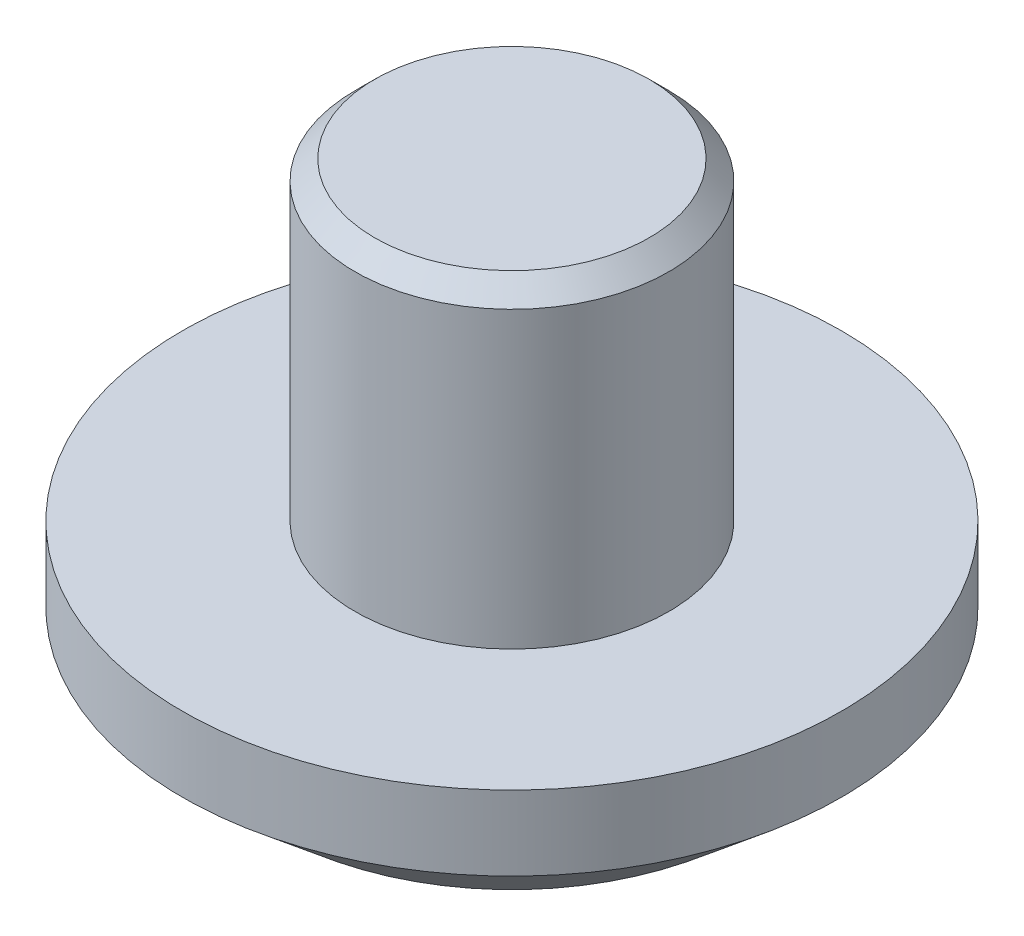
ISO-10303-21;
HEADER;
FILE_DESCRIPTION(('STEP AP214'),'2;1');
FILE_NAME('part.step','',(''),(''),'','','');
FILE_SCHEMA(('AUTOMOTIVE_DESIGN { 1 0 10303 214 1 1 1 1 }'));
ENDSEC;
DATA;
#1=APPLICATION_CONTEXT('core data for automotive mechanical design processes');
#2=APPLICATION_PROTOCOL_DEFINITION('international standard','automotive_design',2000,#1);
#3=PRODUCT_CONTEXT('',#1,'mechanical');
#4=PRODUCT('Part','Part','',(#3));
#5=PRODUCT_RELATED_PRODUCT_CATEGORY('part','',(#4));
#6=PRODUCT_DEFINITION_FORMATION('','',#4);
#7=PRODUCT_DEFINITION_CONTEXT('part definition',#1,'design');
#8=PRODUCT_DEFINITION('design','',#6,#7);
#9=PRODUCT_DEFINITION_SHAPE('','',#8);
#10=(LENGTH_UNIT() NAMED_UNIT(*) SI_UNIT(.MILLI.,.METRE.));
#11=(NAMED_UNIT(*) PLANE_ANGLE_UNIT() SI_UNIT($,.RADIAN.));
#12=(NAMED_UNIT(*) SI_UNIT($,.STERADIAN.) SOLID_ANGLE_UNIT());
#13=UNCERTAINTY_MEASURE_WITH_UNIT(LENGTH_MEASURE(1.E-05),#10,'distance_accuracy_value','');
#14=(GEOMETRIC_REPRESENTATION_CONTEXT(3) GLOBAL_UNCERTAINTY_ASSIGNED_CONTEXT((#13)) GLOBAL_UNIT_ASSIGNED_CONTEXT((#10,
#11,#12)) REPRESENTATION_CONTEXT('',''));
#15=CARTESIAN_POINT('',(0.,0.,0.));
#16=DIRECTION('',(0.,0.,1.));
#17=DIRECTION('',(1.,0.,0.));
#18=AXIS2_PLACEMENT_3D('',#15,#16,#17);
#19=CARTESIAN_POINT('',(4.2,0.,0.));
#20=DIRECTION('',(0.,1.,0.));
#21=DIRECTION('',(0.,0.,1.));
#22=AXIS2_PLACEMENT_3D('',#19,#20,#21);
#23=PLANE('',#22);
#24=CARTESIAN_POINT('',(0.,0.,0.));
#25=DIRECTION('',(0.,-1.,0.));
#26=DIRECTION('',(0.,0.,-1.));
#27=AXIS2_PLACEMENT_3D('',#24,#25,#26);
#28=CIRCLE('',#27,2.);
#29=CARTESIAN_POINT('',(0.,0.,-2.));
#30=VERTEX_POINT('',#29);
#31=EDGE_CURVE('E147',#30,#30,#28,.T.);
#32=ORIENTED_EDGE('',*,*,#31,.T.);
#33=EDGE_LOOP('',(#32));
#34=FACE_BOUND('',#33,.T.);
#35=CARTESIAN_POINT('',(0.,0.,0.));
#36=DIRECTION('',(0.,-1.,0.));
#37=DIRECTION('',(0.,0.,-1.));
#38=AXIS2_PLACEMENT_3D('',#35,#36,#37);
#39=CIRCLE('',#38,4.2);
#40=CARTESIAN_POINT('',(0.,0.,-4.2));
#41=VERTEX_POINT('',#40);
#42=EDGE_CURVE('E11',#41,#41,#39,.T.);
#43=ORIENTED_EDGE('',*,*,#42,.F.);
#44=EDGE_LOOP('',(#43));
#45=FACE_BOUND('',#44,.T.);
#46=ADVANCED_FACE('F39',(#34,#45),#23,.T.);
#47=CARTESIAN_POINT('',(0.,0.,0.));
#48=DIRECTION('',(0.,-1.,0.));
#49=DIRECTION('',(0.,0.,-1.));
#50=AXIS2_PLACEMENT_3D('',#47,#48,#49);
#51=CYLINDRICAL_SURFACE('',#50,4.2);
#52=ORIENTED_EDGE('',*,*,#42,.T.);
#53=EDGE_LOOP('',(#52));
#54=FACE_BOUND('',#53,.T.);
#55=CARTESIAN_POINT('',(0.,-0.95,0.));
#56=DIRECTION('',(0.,-1.,0.));
#57=DIRECTION('',(0.,0.,-1.));
#58=AXIS2_PLACEMENT_3D('',#55,#56,#57);
#59=CIRCLE('',#58,4.2);
#60=CARTESIAN_POINT('',(0.,-0.95,-4.2));
#61=VERTEX_POINT('',#60);
#62=EDGE_CURVE('E46',#61,#61,#59,.T.);
#63=ORIENTED_EDGE('',*,*,#62,.F.);
#64=EDGE_LOOP('',(#63));
#65=FACE_BOUND('',#64,.T.);
#66=ADVANCED_FACE('F216',(#54,#65),#51,.T.);
#67=CARTESIAN_POINT('',(0.,-1.9,0.));
#68=DIRECTION('',(0.,1.,0.));
#69=DIRECTION('',(0.,0.,1.));
#70=AXIS2_PLACEMENT_3D('',#67,#68,#69);
#71=CONICAL_SURFACE('',#70,3.0678340870355,0.872664625997167);
#72=ORIENTED_EDGE('',*,*,#62,.T.);
#73=EDGE_LOOP('',(#72));
#74=FACE_BOUND('',#73,.T.);
#75=CARTESIAN_POINT('',(0.,-1.9,0.));
#76=DIRECTION('',(0.,-1.,0.));
#77=DIRECTION('',(0.,0.,-1.));
#78=AXIS2_PLACEMENT_3D('',#75,#76,#77);
#79=CIRCLE('',#78,3.0678340870355);
#80=CARTESIAN_POINT('',(0.,-1.9,-3.0678340870355));
#81=VERTEX_POINT('',#80);
#82=EDGE_CURVE('E231',#81,#81,#79,.T.);
#83=ORIENTED_EDGE('',*,*,#82,.F.);
#84=EDGE_LOOP('',(#83));
#85=FACE_BOUND('',#84,.T.);
#86=ADVANCED_FACE('F221',(#74,#85),#71,.T.);
#87=CARTESIAN_POINT('',(1.25,-1.9,0.));
#88=DIRECTION('',(0.,-1.,0.));
#89=DIRECTION('',(0.,0.,-1.));
#90=AXIS2_PLACEMENT_3D('',#87,#88,#89);
#91=PLANE('',#90);
#92=DIRECTION('',(0.5,0.,-0.866025403784438));
#93=VECTOR('',#92,1.);
#94=CARTESIAN_POINT('',(-1.44337567297406,-1.9,0.));
#95=LINE('',#94,#93);
#96=CARTESIAN_POINT('',(-1.44337567297406,-1.9,0.));
#97=VERTEX_POINT('',#96);
#98=CARTESIAN_POINT('',(-0.721687836487032,-1.9,-1.25));
#99=VERTEX_POINT('',#98);
#100=EDGE_CURVE('E125',#97,#99,#95,.T.);
#101=ORIENTED_EDGE('',*,*,#100,.F.);
#102=DIRECTION('',(-0.499999999999999,0.,-0.866025403784439));
#103=VECTOR('',#102,1.);
#104=CARTESIAN_POINT('',(-0.721687836487033,-1.9,1.25));
#105=LINE('',#104,#103);
#106=CARTESIAN_POINT('',(-0.721687836487033,-1.9,1.25));
#107=VERTEX_POINT('',#106);
#108=EDGE_CURVE('E120',#107,#97,#105,.T.);
#109=ORIENTED_EDGE('',*,*,#108,.F.);
#110=DIRECTION('',(-1.,0.,0.));
#111=VECTOR('',#110,1.);
#112=CARTESIAN_POINT('',(0.721687836487032,-1.9,1.25));
#113=LINE('',#112,#111);
#114=CARTESIAN_POINT('',(0.721687836487032,-1.9,1.25));
#115=VERTEX_POINT('',#114);
#116=EDGE_CURVE('E118',#115,#107,#113,.T.);
#117=ORIENTED_EDGE('',*,*,#116,.F.);
#118=DIRECTION('',(-0.5,0.,0.866025403784438));
#119=VECTOR('',#118,1.);
#120=CARTESIAN_POINT('',(1.44337567297406,-1.9,0.));
#121=LINE('',#120,#119);
#122=CARTESIAN_POINT('',(1.44337567297406,-1.9,0.));
#123=VERTEX_POINT('',#122);
#124=EDGE_CURVE('E103',#123,#115,#121,.T.);
#125=ORIENTED_EDGE('',*,*,#124,.F.);
#126=DIRECTION('',(0.499999999999999,0.,0.866025403784439));
#127=VECTOR('',#126,1.);
#128=CARTESIAN_POINT('',(0.721687836487033,-1.9,-1.25));
#129=LINE('',#128,#127);
#130=CARTESIAN_POINT('',(0.721687836487033,-1.9,-1.25));
#131=VERTEX_POINT('',#130);
#132=EDGE_CURVE('E95',#131,#123,#129,.T.);
#133=ORIENTED_EDGE('',*,*,#132,.F.);
#134=DIRECTION('',(1.,0.,0.));
#135=VECTOR('',#134,1.);
#136=CARTESIAN_POINT('',(-0.721687836487032,-1.9,-1.25));
#137=LINE('',#136,#135);
#138=EDGE_CURVE('E111',#99,#131,#137,.T.);
#139=ORIENTED_EDGE('',*,*,#138,.F.);
#140=EDGE_LOOP('',(#101,#109,#117,#125,#133,#139));
#141=FACE_BOUND('',#140,.T.);
#142=ORIENTED_EDGE('',*,*,#82,.T.);
#143=EDGE_LOOP('',(#142));
#144=FACE_BOUND('',#143,.T.);
#145=ADVANCED_FACE('F115',(#141,#144),#91,.T.);
#146=CARTESIAN_POINT('',(1.75,4.,0.));
#147=DIRECTION('',(0.,1.,0.));
#148=DIRECTION('',(0.,0.,1.));
#149=AXIS2_PLACEMENT_3D('',#146,#147,#148);
#150=PLANE('',#149);
#151=CARTESIAN_POINT('',(0.,4.,0.));
#152=DIRECTION('',(0.,-1.,0.));
#153=DIRECTION('',(0.,0.,-1.));
#154=AXIS2_PLACEMENT_3D('',#151,#152,#153);
#155=CIRCLE('',#154,1.75);
#156=CARTESIAN_POINT('',(0.,4.,-1.75));
#157=VERTEX_POINT('',#156);
#158=EDGE_CURVE('E233',#157,#157,#155,.T.);
#159=ORIENTED_EDGE('',*,*,#158,.F.);
#160=EDGE_LOOP('',(#159));
#161=FACE_BOUND('',#160,.T.);
#162=ADVANCED_FACE('F157',(#161),#150,.T.);
#163=CARTESIAN_POINT('',(0.,3.75,0.));
#164=DIRECTION('',(0.,-1.,0.));
#165=DIRECTION('',(0.,0.,-1.));
#166=AXIS2_PLACEMENT_3D('',#163,#164,#165);
#167=CONICAL_SURFACE('',#166,2.,0.785398163397451);
#168=ORIENTED_EDGE('',*,*,#158,.T.);
#169=EDGE_LOOP('',(#168));
#170=FACE_BOUND('',#169,.T.);
#171=CARTESIAN_POINT('',(0.,3.75,0.));
#172=DIRECTION('',(0.,-1.,0.));
#173=DIRECTION('',(0.,0.,-1.));
#174=AXIS2_PLACEMENT_3D('',#171,#172,#173);
#175=CIRCLE('',#174,2.);
#176=CARTESIAN_POINT('',(0.,3.75,-2.));
#177=VERTEX_POINT('',#176);
#178=EDGE_CURVE('E237',#177,#177,#175,.T.);
#179=ORIENTED_EDGE('',*,*,#178,.F.);
#180=EDGE_LOOP('',(#179));
#181=FACE_BOUND('',#180,.T.);
#182=ADVANCED_FACE('F244',(#170,#181),#167,.T.);
#183=CARTESIAN_POINT('',(0.,0.,0.));
#184=DIRECTION('',(0.,-1.,0.));
#185=DIRECTION('',(0.,0.,-1.));
#186=AXIS2_PLACEMENT_3D('',#183,#184,#185);
#187=CYLINDRICAL_SURFACE('',#186,2.);
#188=ORIENTED_EDGE('',*,*,#178,.T.);
#189=EDGE_LOOP('',(#188));
#190=FACE_BOUND('',#189,.T.);
#191=ORIENTED_EDGE('',*,*,#31,.F.);
#192=EDGE_LOOP('',(#191));
#193=FACE_BOUND('',#192,.T.);
#194=ADVANCED_FACE('F241',(#190,#193),#187,.T.);
#195=CARTESIAN_POINT('',(0.721687836487033,4.001,-1.25));
#196=DIRECTION('',(0.866025403784439,0.,-0.499999999999999));
#197=DIRECTION('',(-0.499999999999999,0.,-0.866025403784439));
#198=AXIS2_PLACEMENT_3D('',#195,#196,#197);
#199=PLANE('',#198);
#200=CARTESIAN_POINT('',(1.4434911430279,-0.867336990085658,0.000200000000000697));
#201=CARTESIAN_POINT('',(1.41166056551831,-0.848201640045286,-0.0549321774808735));
#202=CARTESIAN_POINT('',(1.3795323867786,-0.83079028725422,-0.110579815412709));
#203=CARTESIAN_POINT('',(1.31467131835198,-0.800406022148305,-0.222922481360818));
#204=CARTESIAN_POINT('',(1.28193705101572,-0.787445002164892,-0.279619895535762));
#205=CARTESIAN_POINT('',(1.21690829049384,-0.76733777238319,-0.392253012712887));
#206=CARTESIAN_POINT('',(1.18462556763481,-0.760044858887183,-0.448168328911387));
#207=CARTESIAN_POINT('',(1.11989904931006,-0.75142687416084,-0.560277947246892));
#208=CARTESIAN_POINT('',(1.08745553287578,-0.750093693879618,-0.616471766087259));
#209=CARTESIAN_POINT('',(1.02711351627889,-0.753273781771391,-0.720987204664233));
#210=CARTESIAN_POINT('',(0.999203806860552,-0.757007936739888,-0.769328239401286));
#211=CARTESIAN_POINT('',(0.943582164541536,-0.768708299678266,-0.865667749898246));
#212=CARTESIAN_POINT('',(0.915870460134862,-0.776678782683593,-0.913665829894935));
#213=CARTESIAN_POINT('',(0.860127887352944,-0.796553437558865,-1.01021479809782));
#214=CARTESIAN_POINT('',(0.832105201280304,-0.808547005020355,-1.05875151414019));
#215=CARTESIAN_POINT('',(0.776509232229035,-0.835720158934061,-1.15504655723301));
#216=CARTESIAN_POINT('',(0.748935115104291,-0.850892864948047,-1.20280632906692));
#217=CARTESIAN_POINT('',(0.721572366433196,-0.867336990085659,-1.2502));
#218=B_SPLINE_CURVE_WITH_KNOTS('',3,(#200,#201,#202,#203,#204,#205,#206,#207,#208,#209,#210,
#211,#212,#213,#214,#215,#216,#217),.UNSPECIFIED.,.F.,.F.,(4,2,2,2,2,2,2,2,4),(0.,
0.199512657914707,0.399554385151121,0.594228120803215,0.788636894818881,0.956299136613698,
1.12413089472286,1.29597067854345,1.46744233074482),.UNSPECIFIED.);
#219=CARTESIAN_POINT('',(1.44337567297406,-0.867267600352527,0.));
#220=VERTEX_POINT('',#219);
#221=CARTESIAN_POINT('',(0.721687836487033,-0.867267600352528,-1.25));
#222=VERTEX_POINT('',#221);
#223=EDGE_CURVE('E69',#220,#222,#218,.T.);
#224=ORIENTED_EDGE('',*,*,#223,.T.);
#225=DIRECTION('',(0.,-1.,0.));
#226=VECTOR('',#225,1.);
#227=CARTESIAN_POINT('',(0.721687836487033,4.001,-1.25));
#228=LINE('',#227,#226);
#229=EDGE_CURVE('E100',#222,#131,#228,.T.);
#230=ORIENTED_EDGE('',*,*,#229,.T.);
#231=ORIENTED_EDGE('',*,*,#132,.T.);
#232=DIRECTION('',(0.,-1.,0.));
#233=VECTOR('',#232,1.);
#234=CARTESIAN_POINT('',(1.44337567297406,4.001,0.));
#235=LINE('',#234,#233);
#236=EDGE_CURVE('E98',#220,#123,#235,.T.);
#237=ORIENTED_EDGE('',*,*,#236,.F.);
#238=EDGE_LOOP('',(#224,#230,#231,#237));
#239=FACE_BOUND('',#238,.T.);
#240=ADVANCED_FACE('F97',(#239),#199,.F.);
#241=CARTESIAN_POINT('',(-0.721687836487032,4.001,-1.25));
#242=DIRECTION('',(0.,0.,-1.));
#243=DIRECTION('',(-1.,0.,0.));
#244=AXIS2_PLACEMENT_3D('',#241,#242,#243);
#245=PLANE('',#244);
#246=CARTESIAN_POINT('',(-1.85589092175444,-1.34448268050436,-1.25));
#247=CARTESIAN_POINT('',(-1.80302077334859,-1.31814133931803,-1.25));
#248=CARTESIAN_POINT('',(-1.75001419243264,-1.29206947161206,-1.25));
#249=CARTESIAN_POINT('',(-1.64365679132375,-1.24061347155318,-1.25));
#250=CARTESIAN_POINT('',(-1.59030591040446,-1.21522946486827,-1.25));
#251=CARTESIAN_POINT('',(-1.48288056211674,-1.16515516772444,-1.25));
#252=CARTESIAN_POINT('',(-1.42880366542578,-1.14047006224663,-1.25));
#253=CARTESIAN_POINT('',(-1.32017210053097,-1.09218341822004,-1.25));
#254=CARTESIAN_POINT('',(-1.26561745772157,-1.06858182248895,-1.25));
#255=CARTESIAN_POINT('',(-1.09804470747578,-0.998509094067042,-1.25));
#256=CARTESIAN_POINT('',(-0.984105996597904,-0.95419767341358,-1.25));
#257=CARTESIAN_POINT('',(-0.753130098382715,-0.875024662206792,-1.25));
#258=CARTESIAN_POINT('',(-0.636101797771903,-0.840138650704296,-1.25));
#259=CARTESIAN_POINT('',(-0.456727509171135,-0.798938418566593,-1.25));
#260=CARTESIAN_POINT('',(-0.395690409102498,-0.787000594281684,-1.25));
#261=CARTESIAN_POINT('',(-0.27285635956705,-0.767935067695702,-1.25));
#262=CARTESIAN_POINT('',(-0.211059508644579,-0.760806748136742,-1.25));
#263=CARTESIAN_POINT('',(-0.0878706654084499,-0.752045082711515,-1.25));
#264=CARTESIAN_POINT('',(-0.0264837898336929,-0.750341789379297,-1.25));
#265=CARTESIAN_POINT('',(0.096199685044951,-0.752393717822937,-1.25));
#266=CARTESIAN_POINT('',(0.157496273472973,-0.756149550705482,-1.25));
#267=CARTESIAN_POINT('',(0.30325169907097,-0.77123660858326,-1.25));
#268=CARTESIAN_POINT('',(0.387464132177416,-0.784942721645049,-1.25));
#269=CARTESIAN_POINT('',(0.554212813171221,-0.820238781948555,-1.25));
#270=CARTESIAN_POINT('',(0.636747513853804,-0.841835686276225,-1.25));
#271=CARTESIAN_POINT('',(0.802103094080825,-0.89134129108199,-1.25));
#272=CARTESIAN_POINT('',(0.884879942891852,-0.919393743415125,-1.25));
#273=CARTESIAN_POINT('',(1.0078524787882,-0.964605576549299,-1.25));
#274=CARTESIAN_POINT('',(1.04864072959219,-0.980196755783813,-1.25));
#275=CARTESIAN_POINT('',(1.1298680648489,-1.01226109467773,-1.25));
#276=CARTESIAN_POINT('',(1.17030716337964,-1.02873421858196,-1.25));
#277=CARTESIAN_POINT('',(1.30476307030117,-1.08493329920697,-1.25));
#278=CARTESIAN_POINT('',(1.39809703274342,-1.12629055879095,-1.25));
#279=CARTESIAN_POINT('',(1.58353896537255,-1.21167912909344,-1.25));
#280=CARTESIAN_POINT('',(1.67564667986415,-1.2557109871886,-1.25));
#281=CARTESIAN_POINT('',(1.85900173217651,-1.34565740815074,-1.25));
#282=CARTESIAN_POINT('',(1.95024853457283,-1.39157305843297,-1.25));
#283=CARTESIAN_POINT('',(2.13205985923171,-1.48473874326098,-1.25));
#284=CARTESIAN_POINT('',(2.22262435390463,-1.53198883140281,-1.25));
#285=CARTESIAN_POINT('',(2.49395093066618,-1.67539940051979,-1.25));
#286=CARTESIAN_POINT('',(2.67394124425173,-1.77301716686162,-1.25));
#287=CARTESIAN_POINT('',(3.03262436886538,-1.97044050214603,-1.25));
#288=CARTESIAN_POINT('',(3.2113176192725,-2.07024527931987,-1.25));
#289=CARTESIAN_POINT('',(3.54219645376792,-2.25678015723485,-1.25));
#290=CARTESIAN_POINT('',(3.69448910862451,-2.34332054039663,-1.25));
#291=CARTESIAN_POINT('',(3.99867080021444,-2.51714456805373,-1.25));
#292=CARTESIAN_POINT('',(4.15055979168753,-2.60442829163448,-1.25));
#293=CARTESIAN_POINT('',(4.45340250444736,-2.77916775177284,-1.25));
#294=CARTESIAN_POINT('',(4.60435749692067,-2.8666212871044,-1.25));
#295=CARTESIAN_POINT('',(4.90601345707768,-3.04192430011711,-1.25));
#296=CARTESIAN_POINT('',(5.05671445284234,-3.1297737294624,-1.25));
#297=CARTESIAN_POINT('',(5.20733224154629,-3.21776480534403,-1.25));
#298=B_SPLINE_CURVE_WITH_KNOTS('',3,(#246,#247,#248,#249,#250,#251,#252,#253,#254,#255,#256,
#257,#258,#259,#260,#261,#262,#263,#264,#265,#266,#267,#268,#269,#270,#271,#272,#273,#274,#275,
#276,#277,#278,#279,#280,#281,#282,#283,#284,#285,#286,#287,#288,#289,#290,#291,#292,#293,#294,
#295,#296,#297),.UNSPECIFIED.,.F.,.F.,(4,2,2,2,2,2,2,2,2,2,2,2,2,2,2,2,2,2,2,2,2,2,2,2,2,4),(0.,
0.177208291694669,0.35444874292635,0.532771910272069,0.71108565575478,1.07763890640994,
1.44323311709346,1.62965737414326,1.81605770071592,2.00004474000262,2.18405237679253,
2.43949659668173,2.69516658009598,2.95720169280263,3.0881944496303,3.21918189985826,
3.52536812793221,3.83161723183532,4.138045675725,4.44448644448608,5.05872637585757,
5.67274749106234,6.19823531002194,6.72377975302686,7.24715250731799,7.77046300500159),.UNSPECIFIED.);
#299=CARTESIAN_POINT('',(-0.721687836487032,-0.867267600352527,-1.25));
#300=VERTEX_POINT('',#299);
#301=EDGE_CURVE('E185',#222,#300,#298,.F.);
#302=ORIENTED_EDGE('',*,*,#301,.T.);
#303=DIRECTION('',(0.,-1.,0.));
#304=VECTOR('',#303,1.);
#305=CARTESIAN_POINT('',(-0.721687836487032,4.001,-1.25));
#306=LINE('',#305,#304);
#307=EDGE_CURVE('E130',#300,#99,#306,.T.);
#308=ORIENTED_EDGE('',*,*,#307,.T.);
#309=ORIENTED_EDGE('',*,*,#138,.T.);
#310=ORIENTED_EDGE('',*,*,#229,.F.);
#311=EDGE_LOOP('',(#302,#308,#309,#310));
#312=FACE_BOUND('',#311,.T.);
#313=ADVANCED_FACE('F196',(#312),#245,.F.);
#314=CARTESIAN_POINT('',(-1.44337567297406,4.001,0.));
#315=DIRECTION('',(-0.866025403784438,0.,-0.5));
#316=DIRECTION('',(-0.5,0.,0.866025403784439));
#317=AXIS2_PLACEMENT_3D('',#314,#315,#316);
#318=PLANE('',#317);
#319=CARTESIAN_POINT('',(-0.721572366433194,-0.867336990085658,-1.2502));
#320=CARTESIAN_POINT('',(-0.753402943942787,-0.848201640045286,-1.19506782251913));
#321=CARTESIAN_POINT('',(-0.785531122682499,-0.830790287254219,-1.13942018458729));
#322=CARTESIAN_POINT('',(-0.85039219110912,-0.800406022148305,-1.02707751863918));
#323=CARTESIAN_POINT('',(-0.88312645844538,-0.787445002164892,-0.970380104464238));
#324=CARTESIAN_POINT('',(-0.948155218967259,-0.76733777238319,-0.857746987287113));
#325=CARTESIAN_POINT('',(-0.980437941826287,-0.760044858887182,-0.801831671088613));
#326=CARTESIAN_POINT('',(-1.04516446015104,-0.75142687416084,-0.689722052753109));
#327=CARTESIAN_POINT('',(-1.07760797658532,-0.750093693879618,-0.633528233912741));
#328=CARTESIAN_POINT('',(-1.1379499931822,-0.753273781771391,-0.529012795335768));
#329=CARTESIAN_POINT('',(-1.16585970260055,-0.757007936739888,-0.480671760598715));
#330=CARTESIAN_POINT('',(-1.22148134491956,-0.768708299678265,-0.384332250101755));
#331=CARTESIAN_POINT('',(-1.24919304932624,-0.776678782683593,-0.336334170105066));
#332=CARTESIAN_POINT('',(-1.30493562210815,-0.796553437558865,-0.239785201902177));
#333=CARTESIAN_POINT('',(-1.33295830818079,-0.808547005020354,-0.191248485859812));
#334=CARTESIAN_POINT('',(-1.38855427723206,-0.83572015893406,-0.0949534427669875));
#335=CARTESIAN_POINT('',(-1.41612839435681,-0.850892864948047,-0.0471936709330759));
#336=CARTESIAN_POINT('',(-1.4434911430279,-0.867336990085658,0.000199999999999214));
#337=B_SPLINE_CURVE_WITH_KNOTS('',3,(#319,#320,#321,#322,#323,#324,#325,#326,#327,#328,#329,
#330,#331,#332,#333,#334,#335,#336),.UNSPECIFIED.,.F.,.F.,(4,2,2,2,2,2,2,2,4),(0.,
0.199512657914707,0.399554385151121,0.594228120803215,0.788636894818881,0.956299136613698,
1.12413089472286,1.29597067854345,1.46744233074482),.UNSPECIFIED.);
#338=CARTESIAN_POINT('',(-1.44337567297406,-0.867267600352527,0.));
#339=VERTEX_POINT('',#338);
#340=EDGE_CURVE('E178',#300,#339,#337,.T.);
#341=ORIENTED_EDGE('',*,*,#340,.T.);
#342=DIRECTION('',(0.,-1.,0.));
#343=VECTOR('',#342,1.);
#344=CARTESIAN_POINT('',(-1.44337567297406,4.001,0.));
#345=LINE('',#344,#343);
#346=EDGE_CURVE('E133',#339,#97,#345,.T.);
#347=ORIENTED_EDGE('',*,*,#346,.T.);
#348=ORIENTED_EDGE('',*,*,#100,.T.);
#349=ORIENTED_EDGE('',*,*,#307,.F.);
#350=EDGE_LOOP('',(#341,#347,#348,#349));
#351=FACE_BOUND('',#350,.T.);
#352=ADVANCED_FACE('F199',(#351),#318,.F.);
#353=CARTESIAN_POINT('',(-0.721687836487033,4.001,1.25));
#354=DIRECTION('',(-0.866025403784439,0.,0.499999999999999));
#355=DIRECTION('',(0.499999999999999,0.,0.866025403784439));
#356=AXIS2_PLACEMENT_3D('',#353,#354,#355);
#357=PLANE('',#356);
#358=CARTESIAN_POINT('',(-1.4434911430279,-0.867336990085658,-0.000200000000000515));
#359=CARTESIAN_POINT('',(-1.41166056551831,-0.848201640045286,0.0549321774808739));
#360=CARTESIAN_POINT('',(-1.3795323867786,-0.830790287254219,0.11057981541271));
#361=CARTESIAN_POINT('',(-1.31467131835198,-0.800406022148305,0.222922481360818));
#362=CARTESIAN_POINT('',(-1.28193705101572,-0.787445002164892,0.279619895535763));
#363=CARTESIAN_POINT('',(-1.21690829049384,-0.76733777238319,0.392253012712887));
#364=CARTESIAN_POINT('',(-1.18462556763481,-0.760044858887182,0.448168328911388));
#365=CARTESIAN_POINT('',(-1.11989904931006,-0.75142687416084,0.560277947246892));
#366=CARTESIAN_POINT('',(-1.08745553287578,-0.750093693879618,0.616471766087259));
#367=CARTESIAN_POINT('',(-1.02711351627889,-0.753273781771391,0.720987204664233));
#368=CARTESIAN_POINT('',(-0.999203806860552,-0.757007936739888,0.769328239401286));
#369=CARTESIAN_POINT('',(-0.943582164541535,-0.768708299678266,0.865667749898245));
#370=CARTESIAN_POINT('',(-0.915870460134862,-0.776678782683593,0.913665829894935));
#371=CARTESIAN_POINT('',(-0.860127887352944,-0.796553437558865,1.01021479809782));
#372=CARTESIAN_POINT('',(-0.832105201280304,-0.808547005020354,1.05875151414019));
#373=CARTESIAN_POINT('',(-0.776509232229035,-0.83572015893406,1.15504655723301));
#374=CARTESIAN_POINT('',(-0.748935115104291,-0.850892864948047,1.20280632906692));
#375=CARTESIAN_POINT('',(-0.721572366433195,-0.867336990085658,1.2502));
#376=B_SPLINE_CURVE_WITH_KNOTS('',3,(#358,#359,#360,#361,#362,#363,#364,#365,#366,#367,#368,
#369,#370,#371,#372,#373,#374,#375),.UNSPECIFIED.,.F.,.F.,(4,2,2,2,2,2,2,2,4),(0.,
0.199512657914708,0.399554385151121,0.594228120803215,0.788636894818881,0.956299136613698,
1.12413089472285,1.29597067854345,1.46744233074482),.UNSPECIFIED.);
#377=CARTESIAN_POINT('',(-0.721687836488721,-0.86726760035145,1.25));
#378=VERTEX_POINT('',#377);
#379=EDGE_CURVE('E171',#339,#378,#376,.T.);
#380=ORIENTED_EDGE('',*,*,#379,.T.);
#381=DIRECTION('',(0.,-1.,0.));
#382=VECTOR('',#381,1.);
#383=CARTESIAN_POINT('',(-0.721687836487033,4.001,1.25));
#384=LINE('',#383,#382);
#385=EDGE_CURVE('E136',#378,#107,#384,.T.);
#386=ORIENTED_EDGE('',*,*,#385,.T.);
#387=ORIENTED_EDGE('',*,*,#108,.T.);
#388=ORIENTED_EDGE('',*,*,#346,.F.);
#389=EDGE_LOOP('',(#380,#386,#387,#388));
#390=FACE_BOUND('',#389,.T.);
#391=ADVANCED_FACE('F203',(#390),#357,.F.);
#392=CARTESIAN_POINT('',(0.721687836487032,4.001,1.25));
#393=DIRECTION('',(0.,0.,1.));
#394=DIRECTION('',(1.,0.,0.));
#395=AXIS2_PLACEMENT_3D('',#392,#393,#394);
#396=PLANE('',#395);
#397=CARTESIAN_POINT('',(-1.85589092161267,-1.3444826804337,1.25));
#398=CARTESIAN_POINT('',(-1.80302077321163,-1.3181413392504,1.25));
#399=CARTESIAN_POINT('',(-1.75001419230049,-1.29206947154745,1.25));
#400=CARTESIAN_POINT('',(-1.64365679120126,-1.2406134714946,1.25));
#401=CARTESIAN_POINT('',(-1.5903059102868,-1.2152294648127,1.25));
#402=CARTESIAN_POINT('',(-1.48288056200885,-1.16515516767488,1.25));
#403=CARTESIAN_POINT('',(-1.42880366532282,-1.14047006220008,1.25));
#404=CARTESIAN_POINT('',(-1.32017210043791,-1.09218341817945,1.25));
#405=CARTESIAN_POINT('',(-1.26561745763347,-1.06858182245131,1.25));
#406=CARTESIAN_POINT('',(-1.09804470740319,-0.998509094038372,1.25));
#407=CARTESIAN_POINT('',(-0.984105996535959,-0.954197673390771,1.25));
#408=CARTESIAN_POINT('',(-0.75313009834254,-0.875024662194586,1.25));
#409=CARTESIAN_POINT('',(-0.63610179774286,-0.840138650696838,1.25));
#410=CARTESIAN_POINT('',(-0.456727509160782,-0.798938418564614,1.25));
#411=CARTESIAN_POINT('',(-0.395690409099451,-0.787000594281327,1.25));
#412=CARTESIAN_POINT('',(-0.272856359578786,-0.767935067697407,1.25));
#413=CARTESIAN_POINT('',(-0.211059508663792,-0.760806748138889,1.25));
#414=CARTESIAN_POINT('',(-0.0878706654424728,-0.752045082713166,1.25));
#415=CARTESIAN_POINT('',(-0.0264837898750478,-0.750341789380035,1.25));
#416=CARTESIAN_POINT('',(0.0961996849890785,-0.752393717820569,1.25));
#417=CARTESIAN_POINT('',(0.157496273409914,-0.75614955070092,1.25));
#418=CARTESIAN_POINT('',(0.303251698996564,-0.771236608572835,1.25));
#419=CARTESIAN_POINT('',(0.387464132098912,-0.78494272163113,1.25));
#420=CARTESIAN_POINT('',(0.554212813084804,-0.820238781927543,1.25));
#421=CARTESIAN_POINT('',(0.636747513763571,-0.841835686251613,1.25));
#422=CARTESIAN_POINT('',(0.802103093982905,-0.891341291050207,1.25));
#423=CARTESIAN_POINT('',(0.884879942790065,-0.919393743379767,1.25));
#424=CARTESIAN_POINT('',(1.00785247868064,-0.964605576508728,1.25));
#425=CARTESIAN_POINT('',(1.04864072948271,-0.98019675574153,1.25));
#426=CARTESIAN_POINT('',(1.12986806473559,-1.01226109463207,1.25));
#427=CARTESIAN_POINT('',(1.17030716326442,-1.02873421853464,1.25));
#428=CARTESIAN_POINT('',(1.30476307018528,-1.08493329915656,1.25));
#429=CARTESIAN_POINT('',(1.39809703262866,-1.12629055873946,1.25));
#430=CARTESIAN_POINT('',(1.5835389652599,-1.21167912904023,1.25));
#431=CARTESIAN_POINT('',(1.67564667975247,-1.25571098713476,1.25));
#432=CARTESIAN_POINT('',(1.85900173206668,-1.34565740809592,1.25));
#433=CARTESIAN_POINT('',(1.95024853446387,-1.3915730583778,1.25));
#434=CARTESIAN_POINT('',(2.13205985912439,-1.48473874320532,1.25));
#435=CARTESIAN_POINT('',(2.2226243537981,-1.531988831347,1.25));
#436=CARTESIAN_POINT('',(2.49395093056202,-1.67539940046374,1.25));
#437=CARTESIAN_POINT('',(2.67394124414908,-1.77301716680569,1.25));
#438=CARTESIAN_POINT('',(3.03262436876559,-1.97044050209054,1.25));
#439=CARTESIAN_POINT('',(3.21131761917407,-2.07024527926473,1.25));
#440=CARTESIAN_POINT('',(3.54219645367042,-2.25678015717959,1.25));
#441=CARTESIAN_POINT('',(3.69448910852659,-2.34332054034089,1.25));
#442=CARTESIAN_POINT('',(3.99867080011566,-2.51714456799707,1.25));
#443=CARTESIAN_POINT('',(4.15055979158832,-2.60442829157739,1.25));
#444=CARTESIAN_POINT('',(4.45340250434709,-2.77916775171482,1.25));
#445=CARTESIAN_POINT('',(4.60435749681978,-2.86662128704589,1.25));
#446=CARTESIAN_POINT('',(4.90601345697553,-3.04192430005763,1.25));
#447=CARTESIAN_POINT('',(5.05671445273955,-3.12977372940244,1.25));
#448=CARTESIAN_POINT('',(5.20733224144286,-3.21776480528359,1.25));
#449=B_SPLINE_CURVE_WITH_KNOTS('',3,(#397,#398,#399,#400,#401,#402,#403,#404,#405,#406,#407,
#408,#409,#410,#411,#412,#413,#414,#415,#416,#417,#418,#419,#420,#421,#422,#423,#424,#425,#426,
#427,#428,#429,#430,#431,#432,#433,#434,#435,#436,#437,#438,#439,#440,#441,#442,#443,#444,#445,
#446,#447,#448),.UNSPECIFIED.,.F.,.F.,(4,2,2,2,2,2,2,2,2,2,2,2,2,2,2,2,2,2,2,2,2,2,2,2,2,4),(0.,
0.177208291677701,0.35444874289241,0.532771910220928,0.711085655686439,1.07763890630549,
1.4432331169531,1.62965737398051,1.81605770053082,2.0000447397957,2.18405237656376,
2.43949659643916,2.69516657983959,2.95720169253179,3.08819444935225,3.219181899573,
3.52536812764873,3.83161723155365,4.13804567544519,4.44448644420814,5.05872637558375,
5.67274749079256,6.19823530975036,6.7237797527535,7.24715250704227,7.77046300472349),.UNSPECIFIED.);
#450=CARTESIAN_POINT('',(0.721687836487032,-0.867267600352527,1.25));
#451=VERTEX_POINT('',#450);
#452=EDGE_CURVE('E57',#378,#451,#449,.T.);
#453=ORIENTED_EDGE('',*,*,#452,.T.);
#454=DIRECTION('',(0.,-1.,0.));
#455=VECTOR('',#454,1.);
#456=CARTESIAN_POINT('',(0.721687836487032,4.001,1.25));
#457=LINE('',#456,#455);
#458=EDGE_CURVE('E110',#451,#115,#457,.T.);
#459=ORIENTED_EDGE('',*,*,#458,.T.);
#460=ORIENTED_EDGE('',*,*,#116,.T.);
#461=ORIENTED_EDGE('',*,*,#385,.F.);
#462=EDGE_LOOP('',(#453,#459,#460,#461));
#463=FACE_BOUND('',#462,.T.);
#464=ADVANCED_FACE('F207',(#463),#396,.F.);
#465=CARTESIAN_POINT('',(1.44337567297406,4.001,0.));
#466=DIRECTION('',(0.866025403784438,0.,0.5));
#467=DIRECTION('',(0.5,0.,-0.866025403784439));
#468=AXIS2_PLACEMENT_3D('',#465,#466,#467);
#469=PLANE('',#468);
#470=CARTESIAN_POINT('',(0.721572366433194,-0.867336990085658,1.2502));
#471=CARTESIAN_POINT('',(0.753402943942788,-0.848201640045286,1.19506782251913));
#472=CARTESIAN_POINT('',(0.7855311226825,-0.830790287254219,1.13942018458729));
#473=CARTESIAN_POINT('',(0.85039219110912,-0.800406022148305,1.02707751863918));
#474=CARTESIAN_POINT('',(0.88312645844538,-0.787445002164892,0.970380104464237));
#475=CARTESIAN_POINT('',(0.94815521896726,-0.76733777238319,0.857746987287112));
#476=CARTESIAN_POINT('',(0.980437941826287,-0.760044858887182,0.801831671088612));
#477=CARTESIAN_POINT('',(1.04516446015104,-0.75142687416084,0.689722052753108));
#478=CARTESIAN_POINT('',(1.07760797658532,-0.750093693879618,0.633528233912741));
#479=CARTESIAN_POINT('',(1.1379499931822,-0.753273781771391,0.529012795335767));
#480=CARTESIAN_POINT('',(1.16585970260055,-0.757007936739888,0.480671760598714));
#481=CARTESIAN_POINT('',(1.22148134491956,-0.768708299678265,0.384332250101755));
#482=CARTESIAN_POINT('',(1.24919304932624,-0.776678782683593,0.336334170105065));
#483=CARTESIAN_POINT('',(1.30493562210815,-0.796553437558865,0.239785201902177));
#484=CARTESIAN_POINT('',(1.33295830818079,-0.808547005020354,0.191248485859812));
#485=CARTESIAN_POINT('',(1.38855427723206,-0.83572015893406,0.0949534427669876));
#486=CARTESIAN_POINT('',(1.41612839435681,-0.850892864948047,0.047193670933076));
#487=CARTESIAN_POINT('',(1.4434911430279,-0.867336990085658,-0.000199999999999003));
#488=B_SPLINE_CURVE_WITH_KNOTS('',3,(#470,#471,#472,#473,#474,#475,#476,#477,#478,#479,#480,
#481,#482,#483,#484,#485,#486,#487),.UNSPECIFIED.,.F.,.F.,(4,2,2,2,2,2,2,2,4),(0.,
0.199512657914708,0.399554385151121,0.594228120803216,0.788636894818882,0.956299136613698,
1.12413089472285,1.29597067854345,1.46744233074482),.UNSPECIFIED.);
#489=EDGE_CURVE('E109',#451,#220,#488,.T.);
#490=ORIENTED_EDGE('',*,*,#489,.T.);
#491=ORIENTED_EDGE('',*,*,#236,.T.);
#492=ORIENTED_EDGE('',*,*,#124,.T.);
#493=ORIENTED_EDGE('',*,*,#458,.F.);
#494=EDGE_LOOP('',(#490,#491,#492,#493));
#495=FACE_BOUND('',#494,.T.);
#496=ADVANCED_FACE('F106',(#495),#469,.F.);
#497=CARTESIAN_POINT('',(0.,0.,0.));
#498=DIRECTION('',(0.,-1.,0.));
#499=DIRECTION('',(0.,0.,-1.));
#500=AXIS2_PLACEMENT_3D('',#497,#498,#499);
#501=CONICAL_SURFACE('',#500,0.,1.02974425867665);
#502=ORIENTED_EDGE('',*,*,#340,.F.);
#503=ORIENTED_EDGE('',*,*,#301,.F.);
#504=ORIENTED_EDGE('',*,*,#223,.F.);
#505=ORIENTED_EDGE('',*,*,#489,.F.);
#506=ORIENTED_EDGE('',*,*,#452,.F.);
#507=ORIENTED_EDGE('',*,*,#379,.F.);
#508=EDGE_LOOP('',(#502,#503,#504,#505,#506,#507));
#509=FACE_BOUND('',#508,.T.);
#510=CARTESIAN_POINT('',(0.,0.,0.));
#511=VERTEX_POINT('',#510);
#512=VERTEX_LOOP('',#511);
#513=FACE_BOUND('',#512,.T.);
#514=ADVANCED_FACE('F152',(#509,#513),#501,.F.);
#515=CLOSED_SHELL('',(#46,#66,#86,#145,#162,#182,#194,#240,#313,#352,#391,#464,#496,#514));
#516=MANIFOLD_SOLID_BREP('B2',#515);
#517=ADVANCED_BREP_SHAPE_REPRESENTATION('',(#18,#516),#14);
#518=SHAPE_DEFINITION_REPRESENTATION(#9,#517);
ENDSEC;
END-ISO-10303-21;
